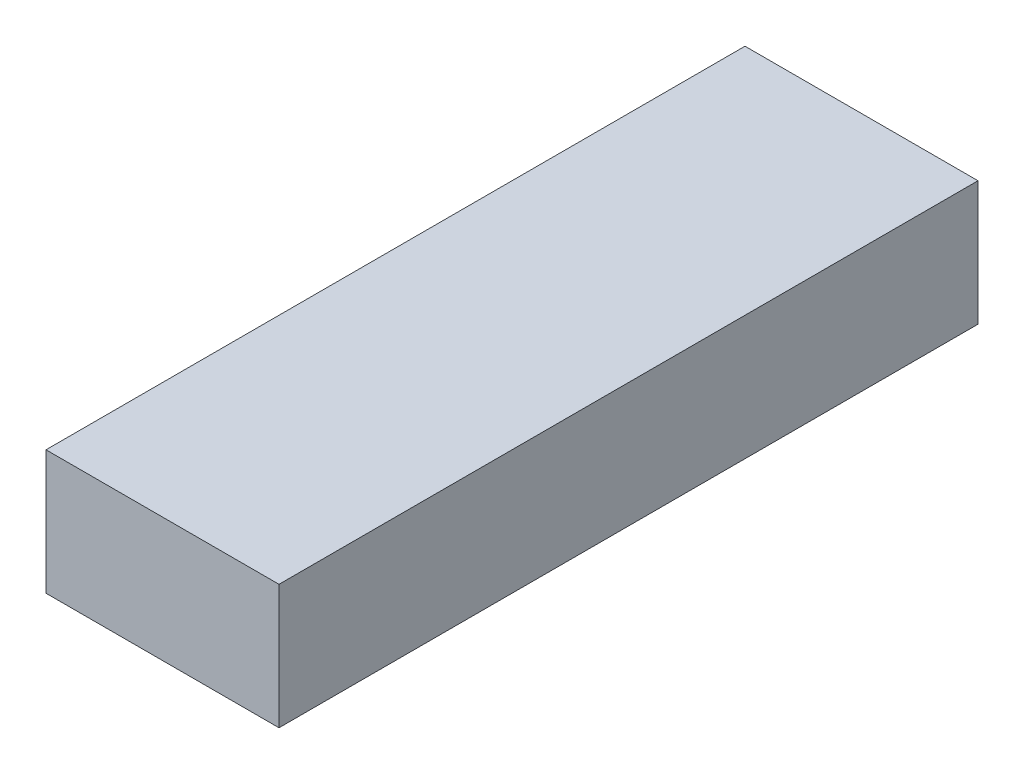
ISO-10303-21;
HEADER;
FILE_DESCRIPTION(('STEP AP214'),'2;1');
FILE_NAME('part.step','',(''),(''),'','','');
FILE_SCHEMA(('AUTOMOTIVE_DESIGN { 1 0 10303 214 1 1 1 1 }'));
ENDSEC;
DATA;
#1=APPLICATION_CONTEXT('core data for automotive mechanical design processes');
#2=APPLICATION_PROTOCOL_DEFINITION('international standard','automotive_design',2000,#1);
#3=PRODUCT_CONTEXT('',#1,'mechanical');
#4=PRODUCT('Part','Part','',(#3));
#5=PRODUCT_RELATED_PRODUCT_CATEGORY('part','',(#4));
#6=PRODUCT_DEFINITION_FORMATION('','',#4);
#7=PRODUCT_DEFINITION_CONTEXT('part definition',#1,'design');
#8=PRODUCT_DEFINITION('design','',#6,#7);
#9=PRODUCT_DEFINITION_SHAPE('','',#8);
#10=(LENGTH_UNIT() NAMED_UNIT(*) SI_UNIT(.MILLI.,.METRE.));
#11=(NAMED_UNIT(*) PLANE_ANGLE_UNIT() SI_UNIT($,.RADIAN.));
#12=(NAMED_UNIT(*) SI_UNIT($,.STERADIAN.) SOLID_ANGLE_UNIT());
#13=UNCERTAINTY_MEASURE_WITH_UNIT(LENGTH_MEASURE(1.E-05),#10,'distance_accuracy_value','');
#14=(GEOMETRIC_REPRESENTATION_CONTEXT(3) GLOBAL_UNCERTAINTY_ASSIGNED_CONTEXT((#13)) GLOBAL_UNIT_ASSIGNED_CONTEXT((#10,
#11,#12)) REPRESENTATION_CONTEXT('',''));
#15=CARTESIAN_POINT('',(0.,0.,0.));
#16=DIRECTION('',(0.,0.,1.));
#17=DIRECTION('',(1.,0.,0.));
#18=AXIS2_PLACEMENT_3D('',#15,#16,#17);
#19=CARTESIAN_POINT('',(0.,0.,180.));
#20=DIRECTION('',(1.,0.,0.));
#21=DIRECTION('',(0.,1.,0.));
#22=AXIS2_PLACEMENT_3D('',#19,#20,#21);
#23=PLANE('',#22);
#24=DIRECTION('',(0.,-1.,0.));
#25=VECTOR('',#24,1.);
#26=CARTESIAN_POINT('',(0.,0.,0.));
#27=LINE('',#26,#25);
#28=CARTESIAN_POINT('',(0.,32.,0.));
#29=VERTEX_POINT('',#28);
#30=CARTESIAN_POINT('',(0.,0.,0.));
#31=VERTEX_POINT('',#30);
#32=EDGE_CURVE('E270',#29,#31,#27,.T.);
#33=ORIENTED_EDGE('',*,*,#32,.T.);
#34=DIRECTION('',(0.,0.,-1.));
#35=VECTOR('',#34,1.);
#36=CARTESIAN_POINT('',(0.,0.,180.));
#37=LINE('',#36,#35);
#38=CARTESIAN_POINT('',(0.,0.,180.));
#39=VERTEX_POINT('',#38);
#40=EDGE_CURVE('E11',#39,#31,#37,.T.);
#41=ORIENTED_EDGE('',*,*,#40,.F.);
#42=DIRECTION('',(0.,-1.,0.));
#43=VECTOR('',#42,1.);
#44=CARTESIAN_POINT('',(0.,0.,180.));
#45=LINE('',#44,#43);
#46=CARTESIAN_POINT('',(0.,32.,180.));
#47=VERTEX_POINT('',#46);
#48=EDGE_CURVE('E493',#47,#39,#45,.T.);
#49=ORIENTED_EDGE('',*,*,#48,.F.);
#50=DIRECTION('',(0.,0.,-1.));
#51=VECTOR('',#50,1.);
#52=CARTESIAN_POINT('',(0.,32.,180.));
#53=LINE('',#52,#51);
#54=EDGE_CURVE('E507',#47,#29,#53,.T.);
#55=ORIENTED_EDGE('',*,*,#54,.T.);
#56=EDGE_LOOP('',(#33,#41,#49,#55));
#57=FACE_BOUND('',#56,.T.);
#58=ADVANCED_FACE('F39',(#57),#23,.F.);
#59=CARTESIAN_POINT('',(0.,0.,180.));
#60=DIRECTION('',(0.,1.,0.));
#61=DIRECTION('',(0.,0.,1.));
#62=AXIS2_PLACEMENT_3D('',#59,#60,#61);
#63=PLANE('',#62);
#64=DIRECTION('',(1.,0.,0.));
#65=VECTOR('',#64,1.);
#66=CARTESIAN_POINT('',(2.,0.,152.));
#67=LINE('',#66,#65);
#68=CARTESIAN_POINT('',(2.,0.,152.));
#69=VERTEX_POINT('',#68);
#70=CARTESIAN_POINT('',(58.,0.,152.));
#71=VERTEX_POINT('',#70);
#72=EDGE_CURVE('E260',#69,#71,#67,.T.);
#73=ORIENTED_EDGE('',*,*,#72,.F.);
#74=DIRECTION('',(0.,0.,-1.));
#75=VECTOR('',#74,1.);
#76=CARTESIAN_POINT('',(2.,0.,178.));
#77=LINE('',#76,#75);
#78=CARTESIAN_POINT('',(2.,0.,178.));
#79=VERTEX_POINT('',#78);
#80=EDGE_CURVE('E54',#79,#69,#77,.T.);
#81=ORIENTED_EDGE('',*,*,#80,.F.);
#82=DIRECTION('',(-1.,0.,0.));
#83=VECTOR('',#82,1.);
#84=CARTESIAN_POINT('',(2.,0.,178.));
#85=LINE('',#84,#83);
#86=CARTESIAN_POINT('',(58.,0.,178.));
#87=VERTEX_POINT('',#86);
#88=EDGE_CURVE('E247',#87,#79,#85,.T.);
#89=ORIENTED_EDGE('',*,*,#88,.F.);
#90=DIRECTION('',(0.,0.,1.));
#91=VECTOR('',#90,1.);
#92=CARTESIAN_POINT('',(58.,0.,178.));
#93=LINE('',#92,#91);
#94=EDGE_CURVE('E251',#71,#87,#93,.T.);
#95=ORIENTED_EDGE('',*,*,#94,.F.);
#96=EDGE_LOOP('',(#73,#81,#89,#95));
#97=FACE_BOUND('',#96,.T.);
#98=DIRECTION('',(1.,0.,0.));
#99=VECTOR('',#98,1.);
#100=CARTESIAN_POINT('',(2.0000000000001,0.,122.5));
#101=LINE('',#100,#99);
#102=CARTESIAN_POINT('',(2.0000000000001,0.,122.5));
#103=VERTEX_POINT('',#102);
#104=CARTESIAN_POINT('',(58.0000000000001,0.,122.5));
#105=VERTEX_POINT('',#104);
#106=EDGE_CURVE('E296',#103,#105,#101,.T.);
#107=ORIENTED_EDGE('',*,*,#106,.F.);
#108=DIRECTION('',(0.,0.,-1.));
#109=VECTOR('',#108,1.);
#110=CARTESIAN_POINT('',(2.0000000000001,0.,148.5));
#111=LINE('',#110,#109);
#112=CARTESIAN_POINT('',(2.0000000000001,0.,148.5));
#113=VERTEX_POINT('',#112);
#114=EDGE_CURVE('E62',#113,#103,#111,.T.);
#115=ORIENTED_EDGE('',*,*,#114,.F.);
#116=DIRECTION('',(-1.,0.,0.));
#117=VECTOR('',#116,1.);
#118=CARTESIAN_POINT('',(2.0000000000001,0.,148.5));
#119=LINE('',#118,#117);
#120=CARTESIAN_POINT('',(58.0000000000001,0.,148.5));
#121=VERTEX_POINT('',#120);
#122=EDGE_CURVE('E281',#121,#113,#119,.T.);
#123=ORIENTED_EDGE('',*,*,#122,.F.);
#124=DIRECTION('',(0.,0.,1.));
#125=VECTOR('',#124,1.);
#126=CARTESIAN_POINT('',(58.0000000000001,0.,148.5));
#127=LINE('',#126,#125);
#128=EDGE_CURVE('E301',#105,#121,#127,.T.);
#129=ORIENTED_EDGE('',*,*,#128,.F.);
#130=EDGE_LOOP('',(#107,#115,#123,#129));
#131=FACE_BOUND('',#130,.T.);
#132=DIRECTION('',(1.,0.,0.));
#133=VECTOR('',#132,1.);
#134=CARTESIAN_POINT('',(2.0000000000002,0.,93.));
#135=LINE('',#134,#133);
#136=CARTESIAN_POINT('',(2.0000000000002,0.,93.));
#137=VERTEX_POINT('',#136);
#138=CARTESIAN_POINT('',(58.0000000000002,0.,93.));
#139=VERTEX_POINT('',#138);
#140=EDGE_CURVE('E339',#137,#139,#135,.T.);
#141=ORIENTED_EDGE('',*,*,#140,.F.);
#142=DIRECTION('',(0.,0.,-1.));
#143=VECTOR('',#142,1.);
#144=CARTESIAN_POINT('',(2.0000000000002,0.,119.));
#145=LINE('',#144,#143);
#146=CARTESIAN_POINT('',(2.0000000000002,0.,119.));
#147=VERTEX_POINT('',#146);
#148=EDGE_CURVE('E336',#147,#137,#145,.T.);
#149=ORIENTED_EDGE('',*,*,#148,.F.);
#150=DIRECTION('',(-1.,0.,0.));
#151=VECTOR('',#150,1.);
#152=CARTESIAN_POINT('',(2.0000000000002,0.,119.));
#153=LINE('',#152,#151);
#154=CARTESIAN_POINT('',(58.0000000000002,0.,119.));
#155=VERTEX_POINT('',#154);
#156=EDGE_CURVE('E323',#155,#147,#153,.T.);
#157=ORIENTED_EDGE('',*,*,#156,.F.);
#158=DIRECTION('',(0.,0.,1.));
#159=VECTOR('',#158,1.);
#160=CARTESIAN_POINT('',(58.0000000000002,0.,119.));
#161=LINE('',#160,#159);
#162=EDGE_CURVE('E344',#139,#155,#161,.T.);
#163=ORIENTED_EDGE('',*,*,#162,.F.);
#164=EDGE_LOOP('',(#141,#149,#157,#163));
#165=FACE_BOUND('',#164,.T.);
#166=DIRECTION('',(1.,0.,0.));
#167=VECTOR('',#166,1.);
#168=CARTESIAN_POINT('',(2.0000000000003,0.,63.5));
#169=LINE('',#168,#167);
#170=CARTESIAN_POINT('',(2.0000000000003,0.,63.5));
#171=VERTEX_POINT('',#170);
#172=CARTESIAN_POINT('',(58.0000000000003,0.,63.5));
#173=VERTEX_POINT('',#172);
#174=EDGE_CURVE('E383',#171,#173,#169,.T.);
#175=ORIENTED_EDGE('',*,*,#174,.F.);
#176=DIRECTION('',(0.,0.,-1.));
#177=VECTOR('',#176,1.);
#178=CARTESIAN_POINT('',(2.0000000000003,0.,89.5));
#179=LINE('',#178,#177);
#180=CARTESIAN_POINT('',(2.0000000000003,0.,89.5));
#181=VERTEX_POINT('',#180);
#182=EDGE_CURVE('E380',#181,#171,#179,.T.);
#183=ORIENTED_EDGE('',*,*,#182,.F.);
#184=DIRECTION('',(-1.,0.,0.));
#185=VECTOR('',#184,1.);
#186=CARTESIAN_POINT('',(2.0000000000003,0.,89.5));
#187=LINE('',#186,#185);
#188=CARTESIAN_POINT('',(58.0000000000003,0.,89.5));
#189=VERTEX_POINT('',#188);
#190=EDGE_CURVE('E367',#189,#181,#187,.T.);
#191=ORIENTED_EDGE('',*,*,#190,.F.);
#192=DIRECTION('',(0.,0.,1.));
#193=VECTOR('',#192,1.);
#194=CARTESIAN_POINT('',(58.0000000000003,0.,89.5));
#195=LINE('',#194,#193);
#196=EDGE_CURVE('E388',#173,#189,#195,.T.);
#197=ORIENTED_EDGE('',*,*,#196,.F.);
#198=EDGE_LOOP('',(#175,#183,#191,#197));
#199=FACE_BOUND('',#198,.T.);
#200=DIRECTION('',(1.,0.,0.));
#201=VECTOR('',#200,1.);
#202=CARTESIAN_POINT('',(2.0000000000004,0.,34.));
#203=LINE('',#202,#201);
#204=CARTESIAN_POINT('',(2.0000000000004,0.,34.));
#205=VERTEX_POINT('',#204);
#206=CARTESIAN_POINT('',(58.0000000000004,0.,34.));
#207=VERTEX_POINT('',#206);
#208=EDGE_CURVE('E427',#205,#207,#203,.T.);
#209=ORIENTED_EDGE('',*,*,#208,.F.);
#210=DIRECTION('',(0.,0.,-1.));
#211=VECTOR('',#210,1.);
#212=CARTESIAN_POINT('',(2.00000000000041,0.,60.));
#213=LINE('',#212,#211);
#214=CARTESIAN_POINT('',(2.00000000000041,0.,60.));
#215=VERTEX_POINT('',#214);
#216=EDGE_CURVE('E424',#215,#205,#213,.T.);
#217=ORIENTED_EDGE('',*,*,#216,.F.);
#218=DIRECTION('',(-1.,0.,0.));
#219=VECTOR('',#218,1.);
#220=CARTESIAN_POINT('',(2.00000000000041,0.,60.));
#221=LINE('',#220,#219);
#222=CARTESIAN_POINT('',(58.0000000000004,0.,60.));
#223=VERTEX_POINT('',#222);
#224=EDGE_CURVE('E411',#223,#215,#221,.T.);
#225=ORIENTED_EDGE('',*,*,#224,.F.);
#226=DIRECTION('',(0.,0.,1.));
#227=VECTOR('',#226,1.);
#228=CARTESIAN_POINT('',(58.0000000000004,0.,60.));
#229=LINE('',#228,#227);
#230=EDGE_CURVE('E432',#207,#223,#229,.T.);
#231=ORIENTED_EDGE('',*,*,#230,.F.);
#232=EDGE_LOOP('',(#209,#217,#225,#231));
#233=FACE_BOUND('',#232,.T.);
#234=DIRECTION('',(1.,0.,0.));
#235=VECTOR('',#234,1.);
#236=CARTESIAN_POINT('',(2.00000000000051,0.,4.5));
#237=LINE('',#236,#235);
#238=CARTESIAN_POINT('',(2.00000000000051,0.,4.50000000000003));
#239=VERTEX_POINT('',#238);
#240=CARTESIAN_POINT('',(58.0000000000005,0.,4.5));
#241=VERTEX_POINT('',#240);
#242=EDGE_CURVE('E471',#239,#241,#237,.T.);
#243=ORIENTED_EDGE('',*,*,#242,.F.);
#244=DIRECTION('',(0.,0.,-1.));
#245=VECTOR('',#244,1.);
#246=CARTESIAN_POINT('',(2.00000000000051,0.,30.5));
#247=LINE('',#246,#245);
#248=CARTESIAN_POINT('',(2.00000000000051,0.,30.5));
#249=VERTEX_POINT('',#248);
#250=EDGE_CURVE('E468',#249,#239,#247,.T.);
#251=ORIENTED_EDGE('',*,*,#250,.F.);
#252=DIRECTION('',(-1.,0.,0.));
#253=VECTOR('',#252,1.);
#254=CARTESIAN_POINT('',(2.00000000000051,0.,30.5));
#255=LINE('',#254,#253);
#256=CARTESIAN_POINT('',(58.0000000000005,0.,30.5));
#257=VERTEX_POINT('',#256);
#258=EDGE_CURVE('E455',#257,#249,#255,.T.);
#259=ORIENTED_EDGE('',*,*,#258,.F.);
#260=DIRECTION('',(0.,0.,1.));
#261=VECTOR('',#260,1.);
#262=CARTESIAN_POINT('',(58.0000000000005,0.,30.5));
#263=LINE('',#262,#261);
#264=EDGE_CURVE('E475',#241,#257,#263,.T.);
#265=ORIENTED_EDGE('',*,*,#264,.F.);
#266=EDGE_LOOP('',(#243,#251,#259,#265));
#267=FACE_BOUND('',#266,.T.);
#268=DIRECTION('',(1.,0.,0.));
#269=VECTOR('',#268,1.);
#270=CARTESIAN_POINT('',(0.,0.,0.));
#271=LINE('',#270,#269);
#272=CARTESIAN_POINT('',(60.,0.,0.));
#273=VERTEX_POINT('',#272);
#274=EDGE_CURVE('E511',#31,#273,#271,.T.);
#275=ORIENTED_EDGE('',*,*,#274,.T.);
#276=DIRECTION('',(0.,0.,-1.));
#277=VECTOR('',#276,1.);
#278=CARTESIAN_POINT('',(60.,0.,180.));
#279=LINE('',#278,#277);
#280=CARTESIAN_POINT('',(60.,0.,180.));
#281=VERTEX_POINT('',#280);
#282=EDGE_CURVE('E47',#281,#273,#279,.T.);
#283=ORIENTED_EDGE('',*,*,#282,.F.);
#284=DIRECTION('',(1.,0.,0.));
#285=VECTOR('',#284,1.);
#286=CARTESIAN_POINT('',(0.,0.,180.));
#287=LINE('',#286,#285);
#288=EDGE_CURVE('E497',#39,#281,#287,.T.);
#289=ORIENTED_EDGE('',*,*,#288,.F.);
#290=ORIENTED_EDGE('',*,*,#40,.T.);
#291=EDGE_LOOP('',(#275,#283,#289,#290));
#292=FACE_BOUND('',#291,.T.);
#293=ADVANCED_FACE('F547',(#97,#131,#165,#199,#233,#267,#292),#63,.F.);
#294=CARTESIAN_POINT('',(60.,0.,180.));
#295=DIRECTION('',(-1.,0.,0.));
#296=DIRECTION('',(0.,-1.,0.));
#297=AXIS2_PLACEMENT_3D('',#294,#295,#296);
#298=PLANE('',#297);
#299=DIRECTION('',(0.,1.,0.));
#300=VECTOR('',#299,1.);
#301=CARTESIAN_POINT('',(60.,0.,0.));
#302=LINE('',#301,#300);
#303=CARTESIAN_POINT('',(60.,32.,0.));
#304=VERTEX_POINT('',#303);
#305=EDGE_CURVE('E514',#273,#304,#302,.T.);
#306=ORIENTED_EDGE('',*,*,#305,.T.);
#307=DIRECTION('',(0.,0.,-1.));
#308=VECTOR('',#307,1.);
#309=CARTESIAN_POINT('',(60.,32.,180.));
#310=LINE('',#309,#308);
#311=CARTESIAN_POINT('',(60.,32.,180.));
#312=VERTEX_POINT('',#311);
#313=EDGE_CURVE('E522',#312,#304,#310,.T.);
#314=ORIENTED_EDGE('',*,*,#313,.F.);
#315=DIRECTION('',(0.,1.,0.));
#316=VECTOR('',#315,1.);
#317=CARTESIAN_POINT('',(60.,0.,180.));
#318=LINE('',#317,#316);
#319=EDGE_CURVE('E501',#281,#312,#318,.T.);
#320=ORIENTED_EDGE('',*,*,#319,.F.);
#321=ORIENTED_EDGE('',*,*,#282,.T.);
#322=EDGE_LOOP('',(#306,#314,#320,#321));
#323=FACE_BOUND('',#322,.T.);
#324=ADVANCED_FACE('F531',(#323),#298,.F.);
#325=CARTESIAN_POINT('',(0.,32.,180.));
#326=DIRECTION('',(0.,-1.,0.));
#327=DIRECTION('',(0.,0.,-1.));
#328=AXIS2_PLACEMENT_3D('',#325,#326,#327);
#329=PLANE('',#328);
#330=DIRECTION('',(-1.,0.,0.));
#331=VECTOR('',#330,1.);
#332=CARTESIAN_POINT('',(0.,32.,0.));
#333=LINE('',#332,#331);
#334=EDGE_CURVE('E498',#304,#29,#333,.T.);
#335=ORIENTED_EDGE('',*,*,#334,.T.);
#336=ORIENTED_EDGE('',*,*,#54,.F.);
#337=DIRECTION('',(-1.,0.,0.));
#338=VECTOR('',#337,1.);
#339=CARTESIAN_POINT('',(0.,32.,180.));
#340=LINE('',#339,#338);
#341=EDGE_CURVE('E504',#312,#47,#340,.T.);
#342=ORIENTED_EDGE('',*,*,#341,.F.);
#343=ORIENTED_EDGE('',*,*,#313,.T.);
#344=EDGE_LOOP('',(#335,#336,#342,#343));
#345=FACE_BOUND('',#344,.T.);
#346=ADVANCED_FACE('F540',(#345),#329,.F.);
#347=CARTESIAN_POINT('',(0.,0.,180.));
#348=DIRECTION('',(0.,0.,-1.));
#349=DIRECTION('',(-1.,0.,0.));
#350=AXIS2_PLACEMENT_3D('',#347,#348,#349);
#351=PLANE('',#350);
#352=ORIENTED_EDGE('',*,*,#48,.T.);
#353=ORIENTED_EDGE('',*,*,#288,.T.);
#354=ORIENTED_EDGE('',*,*,#319,.T.);
#355=ORIENTED_EDGE('',*,*,#341,.T.);
#356=EDGE_LOOP('',(#352,#353,#354,#355));
#357=FACE_BOUND('',#356,.T.);
#358=ADVANCED_FACE('F546',(#357),#351,.F.);
#359=CARTESIAN_POINT('',(0.,0.,0.));
#360=DIRECTION('',(0.,0.,-1.));
#361=DIRECTION('',(-1.,0.,0.));
#362=AXIS2_PLACEMENT_3D('',#359,#360,#361);
#363=PLANE('',#362);
#364=ORIENTED_EDGE('',*,*,#32,.F.);
#365=ORIENTED_EDGE('',*,*,#334,.F.);
#366=ORIENTED_EDGE('',*,*,#305,.F.);
#367=ORIENTED_EDGE('',*,*,#274,.F.);
#368=EDGE_LOOP('',(#364,#365,#366,#367));
#369=FACE_BOUND('',#368,.T.);
#370=ADVANCED_FACE('F537',(#369),#363,.T.);
#371=CARTESIAN_POINT('',(2.00000000000051,30.,30.5));
#372=DIRECTION('',(-1.,0.,0.));
#373=DIRECTION('',(0.,0.,1.));
#374=AXIS2_PLACEMENT_3D('',#371,#372,#373);
#375=PLANE('',#374);
#376=ORIENTED_EDGE('',*,*,#250,.T.);
#377=DIRECTION('',(0.,-1.,0.));
#378=VECTOR('',#377,1.);
#379=CARTESIAN_POINT('',(2.00000000000051,30.,4.5));
#380=LINE('',#379,#378);
#381=CARTESIAN_POINT('',(2.00000000000051,30.,4.5));
#382=VERTEX_POINT('',#381);
#383=EDGE_CURVE('E467',#382,#239,#380,.T.);
#384=ORIENTED_EDGE('',*,*,#383,.F.);
#385=DIRECTION('',(0.,0.,-1.));
#386=VECTOR('',#385,1.);
#387=CARTESIAN_POINT('',(2.00000000000051,30.,30.5));
#388=LINE('',#387,#386);
#389=CARTESIAN_POINT('',(2.00000000000051,30.,30.5));
#390=VERTEX_POINT('',#389);
#391=EDGE_CURVE('E450',#390,#382,#388,.T.);
#392=ORIENTED_EDGE('',*,*,#391,.F.);
#393=DIRECTION('',(0.,-1.,0.));
#394=VECTOR('',#393,1.);
#395=CARTESIAN_POINT('',(2.00000000000051,30.,30.5));
#396=LINE('',#395,#394);
#397=EDGE_CURVE('E428',#390,#249,#396,.T.);
#398=ORIENTED_EDGE('',*,*,#397,.T.);
#399=EDGE_LOOP('',(#376,#384,#392,#398));
#400=FACE_BOUND('',#399,.T.);
#401=ADVANCED_FACE('F561',(#400),#375,.F.);
#402=CARTESIAN_POINT('',(2.00000000000051,30.,30.5));
#403=DIRECTION('',(0.,0.,1.));
#404=DIRECTION('',(1.,0.,0.));
#405=AXIS2_PLACEMENT_3D('',#402,#403,#404);
#406=PLANE('',#405);
#407=ORIENTED_EDGE('',*,*,#258,.T.);
#408=ORIENTED_EDGE('',*,*,#397,.F.);
#409=DIRECTION('',(-1.,0.,0.));
#410=VECTOR('',#409,1.);
#411=CARTESIAN_POINT('',(2.00000000000051,30.,30.5));
#412=LINE('',#411,#410);
#413=CARTESIAN_POINT('',(58.0000000000005,30.,30.5));
#414=VERTEX_POINT('',#413);
#415=EDGE_CURVE('E463',#414,#390,#412,.T.);
#416=ORIENTED_EDGE('',*,*,#415,.F.);
#417=DIRECTION('',(0.,-1.,0.));
#418=VECTOR('',#417,1.);
#419=CARTESIAN_POINT('',(58.0000000000005,30.,30.5));
#420=LINE('',#419,#418);
#421=EDGE_CURVE('E484',#414,#257,#420,.T.);
#422=ORIENTED_EDGE('',*,*,#421,.T.);
#423=EDGE_LOOP('',(#407,#408,#416,#422));
#424=FACE_BOUND('',#423,.T.);
#425=ADVANCED_FACE('F566',(#424),#406,.F.);
#426=CARTESIAN_POINT('',(58.0000000000005,30.,30.5));
#427=DIRECTION('',(1.,0.,0.));
#428=DIRECTION('',(0.,0.,-1.));
#429=AXIS2_PLACEMENT_3D('',#426,#427,#428);
#430=PLANE('',#429);
#431=ORIENTED_EDGE('',*,*,#264,.T.);
#432=ORIENTED_EDGE('',*,*,#421,.F.);
#433=DIRECTION('',(0.,0.,1.));
#434=VECTOR('',#433,1.);
#435=CARTESIAN_POINT('',(58.0000000000005,30.,30.5));
#436=LINE('',#435,#434);
#437=CARTESIAN_POINT('',(58.0000000000005,30.,4.5));
#438=VERTEX_POINT('',#437);
#439=EDGE_CURVE('E459',#438,#414,#436,.T.);
#440=ORIENTED_EDGE('',*,*,#439,.F.);
#441=DIRECTION('',(0.,-1.,0.));
#442=VECTOR('',#441,1.);
#443=CARTESIAN_POINT('',(58.0000000000005,30.,4.5));
#444=LINE('',#443,#442);
#445=EDGE_CURVE('E487',#438,#241,#444,.T.);
#446=ORIENTED_EDGE('',*,*,#445,.T.);
#447=EDGE_LOOP('',(#431,#432,#440,#446));
#448=FACE_BOUND('',#447,.T.);
#449=ADVANCED_FACE('F572',(#448),#430,.F.);
#450=CARTESIAN_POINT('',(2.00000000000051,30.,4.5));
#451=DIRECTION('',(0.,0.,-1.));
#452=DIRECTION('',(-1.,0.,0.));
#453=AXIS2_PLACEMENT_3D('',#450,#451,#452);
#454=PLANE('',#453);
#455=ORIENTED_EDGE('',*,*,#242,.T.);
#456=ORIENTED_EDGE('',*,*,#445,.F.);
#457=DIRECTION('',(1.,0.,0.));
#458=VECTOR('',#457,1.);
#459=CARTESIAN_POINT('',(2.00000000000051,30.,4.5));
#460=LINE('',#459,#458);
#461=EDGE_CURVE('E454',#382,#438,#460,.T.);
#462=ORIENTED_EDGE('',*,*,#461,.F.);
#463=ORIENTED_EDGE('',*,*,#383,.T.);
#464=EDGE_LOOP('',(#455,#456,#462,#463));
#465=FACE_BOUND('',#464,.T.);
#466=ADVANCED_FACE('F568',(#465),#454,.F.);
#467=CARTESIAN_POINT('',(0.,30.,0.));
#468=DIRECTION('',(0.,-1.,0.));
#469=DIRECTION('',(0.,0.,-1.));
#470=AXIS2_PLACEMENT_3D('',#467,#468,#469);
#471=PLANE('',#470);
#472=ORIENTED_EDGE('',*,*,#391,.T.);
#473=ORIENTED_EDGE('',*,*,#461,.T.);
#474=ORIENTED_EDGE('',*,*,#439,.T.);
#475=ORIENTED_EDGE('',*,*,#415,.T.);
#476=EDGE_LOOP('',(#472,#473,#474,#475));
#477=FACE_BOUND('',#476,.T.);
#478=ADVANCED_FACE('F571',(#477),#471,.T.);
#479=CARTESIAN_POINT('',(2.00000000000041,30.,60.));
#480=DIRECTION('',(-1.,0.,0.));
#481=DIRECTION('',(0.,0.,1.));
#482=AXIS2_PLACEMENT_3D('',#479,#480,#481);
#483=PLANE('',#482);
#484=ORIENTED_EDGE('',*,*,#216,.T.);
#485=DIRECTION('',(0.,-1.,0.));
#486=VECTOR('',#485,1.);
#487=CARTESIAN_POINT('',(2.0000000000004,30.,34.));
#488=LINE('',#487,#486);
#489=CARTESIAN_POINT('',(2.0000000000004,30.,34.));
#490=VERTEX_POINT('',#489);
#491=EDGE_CURVE('E423',#490,#205,#488,.T.);
#492=ORIENTED_EDGE('',*,*,#491,.F.);
#493=DIRECTION('',(0.,0.,-1.));
#494=VECTOR('',#493,1.);
#495=CARTESIAN_POINT('',(2.00000000000041,30.,60.));
#496=LINE('',#495,#494);
#497=CARTESIAN_POINT('',(2.00000000000041,30.,60.));
#498=VERTEX_POINT('',#497);
#499=EDGE_CURVE('E406',#498,#490,#496,.T.);
#500=ORIENTED_EDGE('',*,*,#499,.F.);
#501=DIRECTION('',(0.,-1.,0.));
#502=VECTOR('',#501,1.);
#503=CARTESIAN_POINT('',(2.00000000000041,30.,60.));
#504=LINE('',#503,#502);
#505=EDGE_CURVE('E384',#498,#215,#504,.T.);
#506=ORIENTED_EDGE('',*,*,#505,.T.);
#507=EDGE_LOOP('',(#484,#492,#500,#506));
#508=FACE_BOUND('',#507,.T.);
#509=ADVANCED_FACE('F582',(#508),#483,.F.);
#510=CARTESIAN_POINT('',(2.00000000000041,30.,60.));
#511=DIRECTION('',(0.,0.,1.));
#512=DIRECTION('',(1.,0.,0.));
#513=AXIS2_PLACEMENT_3D('',#510,#511,#512);
#514=PLANE('',#513);
#515=ORIENTED_EDGE('',*,*,#224,.T.);
#516=ORIENTED_EDGE('',*,*,#505,.F.);
#517=DIRECTION('',(-1.,0.,0.));
#518=VECTOR('',#517,1.);
#519=CARTESIAN_POINT('',(2.00000000000041,30.,60.));
#520=LINE('',#519,#518);
#521=CARTESIAN_POINT('',(58.0000000000004,30.,60.));
#522=VERTEX_POINT('',#521);
#523=EDGE_CURVE('E419',#522,#498,#520,.T.);
#524=ORIENTED_EDGE('',*,*,#523,.F.);
#525=DIRECTION('',(0.,-1.,0.));
#526=VECTOR('',#525,1.);
#527=CARTESIAN_POINT('',(58.0000000000004,30.,60.));
#528=LINE('',#527,#526);
#529=EDGE_CURVE('E441',#522,#223,#528,.T.);
#530=ORIENTED_EDGE('',*,*,#529,.T.);
#531=EDGE_LOOP('',(#515,#516,#524,#530));
#532=FACE_BOUND('',#531,.T.);
#533=ADVANCED_FACE('F586',(#532),#514,.F.);
#534=CARTESIAN_POINT('',(58.0000000000004,30.,60.));
#535=DIRECTION('',(1.,0.,0.));
#536=DIRECTION('',(0.,0.,-1.));
#537=AXIS2_PLACEMENT_3D('',#534,#535,#536);
#538=PLANE('',#537);
#539=ORIENTED_EDGE('',*,*,#230,.T.);
#540=ORIENTED_EDGE('',*,*,#529,.F.);
#541=DIRECTION('',(0.,0.,1.));
#542=VECTOR('',#541,1.);
#543=CARTESIAN_POINT('',(58.0000000000004,30.,60.));
#544=LINE('',#543,#542);
#545=CARTESIAN_POINT('',(58.0000000000004,30.,34.));
#546=VERTEX_POINT('',#545);
#547=EDGE_CURVE('E415',#546,#522,#544,.T.);
#548=ORIENTED_EDGE('',*,*,#547,.F.);
#549=DIRECTION('',(0.,-1.,0.));
#550=VECTOR('',#549,1.);
#551=CARTESIAN_POINT('',(58.0000000000004,30.,34.));
#552=LINE('',#551,#550);
#553=EDGE_CURVE('E444',#546,#207,#552,.T.);
#554=ORIENTED_EDGE('',*,*,#553,.T.);
#555=EDGE_LOOP('',(#539,#540,#548,#554));
#556=FACE_BOUND('',#555,.T.);
#557=ADVANCED_FACE('F592',(#556),#538,.F.);
#558=CARTESIAN_POINT('',(2.0000000000004,30.,34.));
#559=DIRECTION('',(0.,0.,-1.));
#560=DIRECTION('',(-1.,0.,0.));
#561=AXIS2_PLACEMENT_3D('',#558,#559,#560);
#562=PLANE('',#561);
#563=ORIENTED_EDGE('',*,*,#208,.T.);
#564=ORIENTED_EDGE('',*,*,#553,.F.);
#565=DIRECTION('',(1.,0.,0.));
#566=VECTOR('',#565,1.);
#567=CARTESIAN_POINT('',(2.0000000000004,30.,34.));
#568=LINE('',#567,#566);
#569=EDGE_CURVE('E410',#490,#546,#568,.T.);
#570=ORIENTED_EDGE('',*,*,#569,.F.);
#571=ORIENTED_EDGE('',*,*,#491,.T.);
#572=EDGE_LOOP('',(#563,#564,#570,#571));
#573=FACE_BOUND('',#572,.T.);
#574=ADVANCED_FACE('F588',(#573),#562,.F.);
#575=CARTESIAN_POINT('',(0.,30.,0.));
#576=DIRECTION('',(0.,-1.,0.));
#577=DIRECTION('',(0.,0.,-1.));
#578=AXIS2_PLACEMENT_3D('',#575,#576,#577);
#579=PLANE('',#578);
#580=ORIENTED_EDGE('',*,*,#499,.T.);
#581=ORIENTED_EDGE('',*,*,#569,.T.);
#582=ORIENTED_EDGE('',*,*,#547,.T.);
#583=ORIENTED_EDGE('',*,*,#523,.T.);
#584=EDGE_LOOP('',(#580,#581,#582,#583));
#585=FACE_BOUND('',#584,.T.);
#586=ADVANCED_FACE('F591',(#585),#579,.T.);
#587=CARTESIAN_POINT('',(2.0000000000003,30.,89.5));
#588=DIRECTION('',(-1.,0.,0.));
#589=DIRECTION('',(0.,0.,1.));
#590=AXIS2_PLACEMENT_3D('',#587,#588,#589);
#591=PLANE('',#590);
#592=ORIENTED_EDGE('',*,*,#182,.T.);
#593=DIRECTION('',(0.,-1.,0.));
#594=VECTOR('',#593,1.);
#595=CARTESIAN_POINT('',(2.0000000000003,30.,63.5));
#596=LINE('',#595,#594);
#597=CARTESIAN_POINT('',(2.0000000000003,30.,63.5));
#598=VERTEX_POINT('',#597);
#599=EDGE_CURVE('E379',#598,#171,#596,.T.);
#600=ORIENTED_EDGE('',*,*,#599,.F.);
#601=DIRECTION('',(0.,0.,-1.));
#602=VECTOR('',#601,1.);
#603=CARTESIAN_POINT('',(2.0000000000003,30.,89.5));
#604=LINE('',#603,#602);
#605=CARTESIAN_POINT('',(2.0000000000003,30.,89.5));
#606=VERTEX_POINT('',#605);
#607=EDGE_CURVE('E362',#606,#598,#604,.T.);
#608=ORIENTED_EDGE('',*,*,#607,.F.);
#609=DIRECTION('',(0.,-1.,0.));
#610=VECTOR('',#609,1.);
#611=CARTESIAN_POINT('',(2.0000000000003,30.,89.5));
#612=LINE('',#611,#610);
#613=EDGE_CURVE('E340',#606,#181,#612,.T.);
#614=ORIENTED_EDGE('',*,*,#613,.T.);
#615=EDGE_LOOP('',(#592,#600,#608,#614));
#616=FACE_BOUND('',#615,.T.);
#617=ADVANCED_FACE('F602',(#616),#591,.F.);
#618=CARTESIAN_POINT('',(2.0000000000003,30.,89.5));
#619=DIRECTION('',(0.,0.,1.));
#620=DIRECTION('',(1.,0.,0.));
#621=AXIS2_PLACEMENT_3D('',#618,#619,#620);
#622=PLANE('',#621);
#623=ORIENTED_EDGE('',*,*,#190,.T.);
#624=ORIENTED_EDGE('',*,*,#613,.F.);
#625=DIRECTION('',(-1.,0.,0.));
#626=VECTOR('',#625,1.);
#627=CARTESIAN_POINT('',(2.0000000000003,30.,89.5));
#628=LINE('',#627,#626);
#629=CARTESIAN_POINT('',(58.0000000000003,30.,89.5));
#630=VERTEX_POINT('',#629);
#631=EDGE_CURVE('E375',#630,#606,#628,.T.);
#632=ORIENTED_EDGE('',*,*,#631,.F.);
#633=DIRECTION('',(0.,-1.,0.));
#634=VECTOR('',#633,1.);
#635=CARTESIAN_POINT('',(58.0000000000003,30.,89.5));
#636=LINE('',#635,#634);
#637=EDGE_CURVE('E397',#630,#189,#636,.T.);
#638=ORIENTED_EDGE('',*,*,#637,.T.);
#639=EDGE_LOOP('',(#623,#624,#632,#638));
#640=FACE_BOUND('',#639,.T.);
#641=ADVANCED_FACE('F606',(#640),#622,.F.);
#642=CARTESIAN_POINT('',(58.0000000000003,30.,89.5));
#643=DIRECTION('',(1.,0.,0.));
#644=DIRECTION('',(0.,0.,-1.));
#645=AXIS2_PLACEMENT_3D('',#642,#643,#644);
#646=PLANE('',#645);
#647=ORIENTED_EDGE('',*,*,#196,.T.);
#648=ORIENTED_EDGE('',*,*,#637,.F.);
#649=DIRECTION('',(0.,0.,1.));
#650=VECTOR('',#649,1.);
#651=CARTESIAN_POINT('',(58.0000000000003,30.,89.5));
#652=LINE('',#651,#650);
#653=CARTESIAN_POINT('',(58.0000000000003,30.,63.5));
#654=VERTEX_POINT('',#653);
#655=EDGE_CURVE('E371',#654,#630,#652,.T.);
#656=ORIENTED_EDGE('',*,*,#655,.F.);
#657=DIRECTION('',(0.,-1.,0.));
#658=VECTOR('',#657,1.);
#659=CARTESIAN_POINT('',(58.0000000000003,30.,63.5));
#660=LINE('',#659,#658);
#661=EDGE_CURVE('E400',#654,#173,#660,.T.);
#662=ORIENTED_EDGE('',*,*,#661,.T.);
#663=EDGE_LOOP('',(#647,#648,#656,#662));
#664=FACE_BOUND('',#663,.T.);
#665=ADVANCED_FACE('F612',(#664),#646,.F.);
#666=CARTESIAN_POINT('',(2.0000000000003,30.,63.5));
#667=DIRECTION('',(0.,0.,-1.));
#668=DIRECTION('',(-1.,0.,0.));
#669=AXIS2_PLACEMENT_3D('',#666,#667,#668);
#670=PLANE('',#669);
#671=ORIENTED_EDGE('',*,*,#174,.T.);
#672=ORIENTED_EDGE('',*,*,#661,.F.);
#673=DIRECTION('',(1.,0.,0.));
#674=VECTOR('',#673,1.);
#675=CARTESIAN_POINT('',(2.0000000000003,30.,63.5));
#676=LINE('',#675,#674);
#677=EDGE_CURVE('E366',#598,#654,#676,.T.);
#678=ORIENTED_EDGE('',*,*,#677,.F.);
#679=ORIENTED_EDGE('',*,*,#599,.T.);
#680=EDGE_LOOP('',(#671,#672,#678,#679));
#681=FACE_BOUND('',#680,.T.);
#682=ADVANCED_FACE('F608',(#681),#670,.F.);
#683=CARTESIAN_POINT('',(0.,30.,0.));
#684=DIRECTION('',(0.,-1.,0.));
#685=DIRECTION('',(0.,0.,-1.));
#686=AXIS2_PLACEMENT_3D('',#683,#684,#685);
#687=PLANE('',#686);
#688=ORIENTED_EDGE('',*,*,#607,.T.);
#689=ORIENTED_EDGE('',*,*,#677,.T.);
#690=ORIENTED_EDGE('',*,*,#655,.T.);
#691=ORIENTED_EDGE('',*,*,#631,.T.);
#692=EDGE_LOOP('',(#688,#689,#690,#691));
#693=FACE_BOUND('',#692,.T.);
#694=ADVANCED_FACE('F611',(#693),#687,.T.);
#695=CARTESIAN_POINT('',(2.0000000000002,30.,119.));
#696=DIRECTION('',(-1.,0.,0.));
#697=DIRECTION('',(0.,0.,1.));
#698=AXIS2_PLACEMENT_3D('',#695,#696,#697);
#699=PLANE('',#698);
#700=ORIENTED_EDGE('',*,*,#148,.T.);
#701=DIRECTION('',(0.,-1.,0.));
#702=VECTOR('',#701,1.);
#703=CARTESIAN_POINT('',(2.0000000000002,30.,93.));
#704=LINE('',#703,#702);
#705=CARTESIAN_POINT('',(2.0000000000002,30.,93.));
#706=VERTEX_POINT('',#705);
#707=EDGE_CURVE('E335',#706,#137,#704,.T.);
#708=ORIENTED_EDGE('',*,*,#707,.F.);
#709=DIRECTION('',(0.,0.,-1.));
#710=VECTOR('',#709,1.);
#711=CARTESIAN_POINT('',(2.0000000000002,30.,119.));
#712=LINE('',#711,#710);
#713=CARTESIAN_POINT('',(2.0000000000002,30.,119.));
#714=VERTEX_POINT('',#713);
#715=EDGE_CURVE('E318',#714,#706,#712,.T.);
#716=ORIENTED_EDGE('',*,*,#715,.F.);
#717=DIRECTION('',(0.,-1.,0.));
#718=VECTOR('',#717,1.);
#719=CARTESIAN_POINT('',(2.0000000000002,30.,119.));
#720=LINE('',#719,#718);
#721=EDGE_CURVE('E297',#714,#147,#720,.T.);
#722=ORIENTED_EDGE('',*,*,#721,.T.);
#723=EDGE_LOOP('',(#700,#708,#716,#722));
#724=FACE_BOUND('',#723,.T.);
#725=ADVANCED_FACE('F622',(#724),#699,.F.);
#726=CARTESIAN_POINT('',(2.0000000000002,30.,119.));
#727=DIRECTION('',(0.,0.,1.));
#728=DIRECTION('',(1.,0.,0.));
#729=AXIS2_PLACEMENT_3D('',#726,#727,#728);
#730=PLANE('',#729);
#731=ORIENTED_EDGE('',*,*,#156,.T.);
#732=ORIENTED_EDGE('',*,*,#721,.F.);
#733=DIRECTION('',(-1.,0.,0.));
#734=VECTOR('',#733,1.);
#735=CARTESIAN_POINT('',(2.0000000000002,30.,119.));
#736=LINE('',#735,#734);
#737=CARTESIAN_POINT('',(58.0000000000002,30.,119.));
#738=VERTEX_POINT('',#737);
#739=EDGE_CURVE('E331',#738,#714,#736,.T.);
#740=ORIENTED_EDGE('',*,*,#739,.F.);
#741=DIRECTION('',(0.,-1.,0.));
#742=VECTOR('',#741,1.);
#743=CARTESIAN_POINT('',(58.0000000000002,30.,119.));
#744=LINE('',#743,#742);
#745=EDGE_CURVE('E353',#738,#155,#744,.T.);
#746=ORIENTED_EDGE('',*,*,#745,.T.);
#747=EDGE_LOOP('',(#731,#732,#740,#746));
#748=FACE_BOUND('',#747,.T.);
#749=ADVANCED_FACE('F626',(#748),#730,.F.);
#750=CARTESIAN_POINT('',(58.0000000000002,30.,119.));
#751=DIRECTION('',(1.,0.,0.));
#752=DIRECTION('',(0.,0.,-1.));
#753=AXIS2_PLACEMENT_3D('',#750,#751,#752);
#754=PLANE('',#753);
#755=ORIENTED_EDGE('',*,*,#162,.T.);
#756=ORIENTED_EDGE('',*,*,#745,.F.);
#757=DIRECTION('',(0.,0.,1.));
#758=VECTOR('',#757,1.);
#759=CARTESIAN_POINT('',(58.0000000000002,30.,119.));
#760=LINE('',#759,#758);
#761=CARTESIAN_POINT('',(58.0000000000002,30.,93.));
#762=VERTEX_POINT('',#761);
#763=EDGE_CURVE('E327',#762,#738,#760,.T.);
#764=ORIENTED_EDGE('',*,*,#763,.F.);
#765=DIRECTION('',(0.,-1.,0.));
#766=VECTOR('',#765,1.);
#767=CARTESIAN_POINT('',(58.0000000000002,30.,93.));
#768=LINE('',#767,#766);
#769=EDGE_CURVE('E356',#762,#139,#768,.T.);
#770=ORIENTED_EDGE('',*,*,#769,.T.);
#771=EDGE_LOOP('',(#755,#756,#764,#770));
#772=FACE_BOUND('',#771,.T.);
#773=ADVANCED_FACE('F632',(#772),#754,.F.);
#774=CARTESIAN_POINT('',(2.0000000000002,30.,93.));
#775=DIRECTION('',(0.,0.,-1.));
#776=DIRECTION('',(-1.,0.,0.));
#777=AXIS2_PLACEMENT_3D('',#774,#775,#776);
#778=PLANE('',#777);
#779=ORIENTED_EDGE('',*,*,#140,.T.);
#780=ORIENTED_EDGE('',*,*,#769,.F.);
#781=DIRECTION('',(1.,0.,0.));
#782=VECTOR('',#781,1.);
#783=CARTESIAN_POINT('',(2.0000000000002,30.,93.));
#784=LINE('',#783,#782);
#785=EDGE_CURVE('E322',#706,#762,#784,.T.);
#786=ORIENTED_EDGE('',*,*,#785,.F.);
#787=ORIENTED_EDGE('',*,*,#707,.T.);
#788=EDGE_LOOP('',(#779,#780,#786,#787));
#789=FACE_BOUND('',#788,.T.);
#790=ADVANCED_FACE('F628',(#789),#778,.F.);
#791=CARTESIAN_POINT('',(0.,30.,0.));
#792=DIRECTION('',(0.,-1.,0.));
#793=DIRECTION('',(0.,0.,-1.));
#794=AXIS2_PLACEMENT_3D('',#791,#792,#793);
#795=PLANE('',#794);
#796=ORIENTED_EDGE('',*,*,#715,.T.);
#797=ORIENTED_EDGE('',*,*,#785,.T.);
#798=ORIENTED_EDGE('',*,*,#763,.T.);
#799=ORIENTED_EDGE('',*,*,#739,.T.);
#800=EDGE_LOOP('',(#796,#797,#798,#799));
#801=FACE_BOUND('',#800,.T.);
#802=ADVANCED_FACE('F631',(#801),#795,.T.);
#803=CARTESIAN_POINT('',(2.0000000000001,30.,148.5));
#804=DIRECTION('',(-1.,0.,0.));
#805=DIRECTION('',(0.,0.,1.));
#806=AXIS2_PLACEMENT_3D('',#803,#804,#805);
#807=PLANE('',#806);
#808=ORIENTED_EDGE('',*,*,#114,.T.);
#809=DIRECTION('',(0.,-1.,0.));
#810=VECTOR('',#809,1.);
#811=CARTESIAN_POINT('',(2.0000000000001,30.,122.5));
#812=LINE('',#811,#810);
#813=CARTESIAN_POINT('',(2.0000000000001,30.,122.5));
#814=VERTEX_POINT('',#813);
#815=EDGE_CURVE('E293',#814,#103,#812,.T.);
#816=ORIENTED_EDGE('',*,*,#815,.F.);
#817=DIRECTION('',(0.,0.,-1.));
#818=VECTOR('',#817,1.);
#819=CARTESIAN_POINT('',(2.0000000000001,30.,148.5));
#820=LINE('',#819,#818);
#821=CARTESIAN_POINT('',(2.0000000000001,30.,148.5));
#822=VERTEX_POINT('',#821);
#823=EDGE_CURVE('E276',#822,#814,#820,.T.);
#824=ORIENTED_EDGE('',*,*,#823,.F.);
#825=DIRECTION('',(0.,-1.,0.));
#826=VECTOR('',#825,1.);
#827=CARTESIAN_POINT('',(2.0000000000001,30.,148.5));
#828=LINE('',#827,#826);
#829=EDGE_CURVE('E261',#822,#113,#828,.T.);
#830=ORIENTED_EDGE('',*,*,#829,.T.);
#831=EDGE_LOOP('',(#808,#816,#824,#830));
#832=FACE_BOUND('',#831,.T.);
#833=ADVANCED_FACE('F642',(#832),#807,.F.);
#834=CARTESIAN_POINT('',(2.0000000000001,30.,148.5));
#835=DIRECTION('',(0.,0.,1.));
#836=DIRECTION('',(1.,0.,0.));
#837=AXIS2_PLACEMENT_3D('',#834,#835,#836);
#838=PLANE('',#837);
#839=ORIENTED_EDGE('',*,*,#122,.T.);
#840=ORIENTED_EDGE('',*,*,#829,.F.);
#841=DIRECTION('',(-1.,0.,0.));
#842=VECTOR('',#841,1.);
#843=CARTESIAN_POINT('',(2.0000000000001,30.,148.5));
#844=LINE('',#843,#842);
#845=CARTESIAN_POINT('',(58.0000000000001,30.,148.5));
#846=VERTEX_POINT('',#845);
#847=EDGE_CURVE('E289',#846,#822,#844,.T.);
#848=ORIENTED_EDGE('',*,*,#847,.F.);
#849=DIRECTION('',(0.,-1.,0.));
#850=VECTOR('',#849,1.);
#851=CARTESIAN_POINT('',(58.0000000000001,30.,148.5));
#852=LINE('',#851,#850);
#853=EDGE_CURVE('E310',#846,#121,#852,.T.);
#854=ORIENTED_EDGE('',*,*,#853,.T.);
#855=EDGE_LOOP('',(#839,#840,#848,#854));
#856=FACE_BOUND('',#855,.T.);
#857=ADVANCED_FACE('F646',(#856),#838,.F.);
#858=CARTESIAN_POINT('',(58.0000000000001,30.,148.5));
#859=DIRECTION('',(1.,0.,0.));
#860=DIRECTION('',(0.,0.,-1.));
#861=AXIS2_PLACEMENT_3D('',#858,#859,#860);
#862=PLANE('',#861);
#863=ORIENTED_EDGE('',*,*,#128,.T.);
#864=ORIENTED_EDGE('',*,*,#853,.F.);
#865=DIRECTION('',(0.,0.,1.));
#866=VECTOR('',#865,1.);
#867=CARTESIAN_POINT('',(58.0000000000001,30.,148.5));
#868=LINE('',#867,#866);
#869=CARTESIAN_POINT('',(58.0000000000001,30.,122.5));
#870=VERTEX_POINT('',#869);
#871=EDGE_CURVE('E285',#870,#846,#868,.T.);
#872=ORIENTED_EDGE('',*,*,#871,.F.);
#873=DIRECTION('',(0.,-1.,0.));
#874=VECTOR('',#873,1.);
#875=CARTESIAN_POINT('',(58.0000000000001,30.,122.5));
#876=LINE('',#875,#874);
#877=EDGE_CURVE('E313',#870,#105,#876,.T.);
#878=ORIENTED_EDGE('',*,*,#877,.T.);
#879=EDGE_LOOP('',(#863,#864,#872,#878));
#880=FACE_BOUND('',#879,.T.);
#881=ADVANCED_FACE('F651',(#880),#862,.F.);
#882=CARTESIAN_POINT('',(2.0000000000001,30.,122.5));
#883=DIRECTION('',(0.,0.,-1.));
#884=DIRECTION('',(-1.,0.,0.));
#885=AXIS2_PLACEMENT_3D('',#882,#883,#884);
#886=PLANE('',#885);
#887=ORIENTED_EDGE('',*,*,#106,.T.);
#888=ORIENTED_EDGE('',*,*,#877,.F.);
#889=DIRECTION('',(1.,0.,0.));
#890=VECTOR('',#889,1.);
#891=CARTESIAN_POINT('',(2.0000000000001,30.,122.5));
#892=LINE('',#891,#890);
#893=EDGE_CURVE('E280',#814,#870,#892,.T.);
#894=ORIENTED_EDGE('',*,*,#893,.F.);
#895=ORIENTED_EDGE('',*,*,#815,.T.);
#896=EDGE_LOOP('',(#887,#888,#894,#895));
#897=FACE_BOUND('',#896,.T.);
#898=ADVANCED_FACE('F647',(#897),#886,.F.);
#899=CARTESIAN_POINT('',(0.,30.,0.));
#900=DIRECTION('',(0.,-1.,0.));
#901=DIRECTION('',(0.,0.,-1.));
#902=AXIS2_PLACEMENT_3D('',#899,#900,#901);
#903=PLANE('',#902);
#904=ORIENTED_EDGE('',*,*,#823,.T.);
#905=ORIENTED_EDGE('',*,*,#893,.T.);
#906=ORIENTED_EDGE('',*,*,#871,.T.);
#907=ORIENTED_EDGE('',*,*,#847,.T.);
#908=EDGE_LOOP('',(#904,#905,#906,#907));
#909=FACE_BOUND('',#908,.T.);
#910=ADVANCED_FACE('F650',(#909),#903,.T.);
#911=CARTESIAN_POINT('',(2.,30.,178.));
#912=DIRECTION('',(-1.,0.,0.));
#913=DIRECTION('',(0.,0.,1.));
#914=AXIS2_PLACEMENT_3D('',#911,#912,#913);
#915=PLANE('',#914);
#916=ORIENTED_EDGE('',*,*,#80,.T.);
#917=DIRECTION('',(0.,-1.,0.));
#918=VECTOR('',#917,1.);
#919=CARTESIAN_POINT('',(2.,30.,152.));
#920=LINE('',#919,#918);
#921=CARTESIAN_POINT('',(2.,30.,152.));
#922=VERTEX_POINT('',#921);
#923=EDGE_CURVE('E222',#922,#69,#920,.T.);
#924=ORIENTED_EDGE('',*,*,#923,.F.);
#925=DIRECTION('',(0.,0.,-1.));
#926=VECTOR('',#925,1.);
#927=CARTESIAN_POINT('',(2.,30.,178.));
#928=LINE('',#927,#926);
#929=CARTESIAN_POINT('',(2.,30.,178.));
#930=VERTEX_POINT('',#929);
#931=EDGE_CURVE('E226',#930,#922,#928,.T.);
#932=ORIENTED_EDGE('',*,*,#931,.F.);
#933=DIRECTION('',(0.,-1.,0.));
#934=VECTOR('',#933,1.);
#935=CARTESIAN_POINT('',(2.,30.,178.));
#936=LINE('',#935,#934);
#937=EDGE_CURVE('E267',#930,#79,#936,.T.);
#938=ORIENTED_EDGE('',*,*,#937,.T.);
#939=EDGE_LOOP('',(#916,#924,#932,#938));
#940=FACE_BOUND('',#939,.T.);
#941=ADVANCED_FACE('F224',(#940),#915,.F.);
#942=CARTESIAN_POINT('',(2.,30.,178.));
#943=DIRECTION('',(0.,0.,1.));
#944=DIRECTION('',(1.,0.,0.));
#945=AXIS2_PLACEMENT_3D('',#942,#943,#944);
#946=PLANE('',#945);
#947=ORIENTED_EDGE('',*,*,#88,.T.);
#948=ORIENTED_EDGE('',*,*,#937,.F.);
#949=DIRECTION('',(-1.,0.,0.));
#950=VECTOR('',#949,1.);
#951=CARTESIAN_POINT('',(2.,30.,178.));
#952=LINE('',#951,#950);
#953=CARTESIAN_POINT('',(58.,30.,178.));
#954=VERTEX_POINT('',#953);
#955=EDGE_CURVE('E233',#954,#930,#952,.T.);
#956=ORIENTED_EDGE('',*,*,#955,.F.);
#957=DIRECTION('',(0.,-1.,0.));
#958=VECTOR('',#957,1.);
#959=CARTESIAN_POINT('',(58.,30.,178.));
#960=LINE('',#959,#958);
#961=EDGE_CURVE('E271',#954,#87,#960,.T.);
#962=ORIENTED_EDGE('',*,*,#961,.T.);
#963=EDGE_LOOP('',(#947,#948,#956,#962));
#964=FACE_BOUND('',#963,.T.);
#965=ADVANCED_FACE('F664',(#964),#946,.F.);
#966=CARTESIAN_POINT('',(58.,30.,178.));
#967=DIRECTION('',(1.,0.,0.));
#968=DIRECTION('',(0.,0.,-1.));
#969=AXIS2_PLACEMENT_3D('',#966,#967,#968);
#970=PLANE('',#969);
#971=ORIENTED_EDGE('',*,*,#94,.T.);
#972=ORIENTED_EDGE('',*,*,#961,.F.);
#973=DIRECTION('',(0.,0.,1.));
#974=VECTOR('',#973,1.);
#975=CARTESIAN_POINT('',(58.,30.,178.));
#976=LINE('',#975,#974);
#977=CARTESIAN_POINT('',(58.,30.,152.));
#978=VERTEX_POINT('',#977);
#979=EDGE_CURVE('E242',#978,#954,#976,.T.);
#980=ORIENTED_EDGE('',*,*,#979,.F.);
#981=DIRECTION('',(0.,-1.,0.));
#982=VECTOR('',#981,1.);
#983=CARTESIAN_POINT('',(58.,30.,152.));
#984=LINE('',#983,#982);
#985=EDGE_CURVE('E232',#978,#71,#984,.T.);
#986=ORIENTED_EDGE('',*,*,#985,.T.);
#987=EDGE_LOOP('',(#971,#972,#980,#986));
#988=FACE_BOUND('',#987,.T.);
#989=ADVANCED_FACE('F667',(#988),#970,.F.);
#990=CARTESIAN_POINT('',(2.,30.,152.));
#991=DIRECTION('',(0.,0.,-1.));
#992=DIRECTION('',(-1.,0.,0.));
#993=AXIS2_PLACEMENT_3D('',#990,#991,#992);
#994=PLANE('',#993);
#995=ORIENTED_EDGE('',*,*,#72,.T.);
#996=ORIENTED_EDGE('',*,*,#985,.F.);
#997=DIRECTION('',(1.,0.,0.));
#998=VECTOR('',#997,1.);
#999=CARTESIAN_POINT('',(2.,30.,152.));
#1000=LINE('',#999,#998);
#1001=EDGE_CURVE('E236',#922,#978,#1000,.T.);
#1002=ORIENTED_EDGE('',*,*,#1001,.F.);
#1003=ORIENTED_EDGE('',*,*,#923,.T.);
#1004=EDGE_LOOP('',(#995,#996,#1002,#1003));
#1005=FACE_BOUND('',#1004,.T.);
#1006=ADVANCED_FACE('F237',(#1005),#994,.F.);
#1007=CARTESIAN_POINT('',(0.,30.,0.));
#1008=DIRECTION('',(0.,-1.,0.));
#1009=DIRECTION('',(0.,0.,-1.));
#1010=AXIS2_PLACEMENT_3D('',#1007,#1008,#1009);
#1011=PLANE('',#1010);
#1012=ORIENTED_EDGE('',*,*,#931,.T.);
#1013=ORIENTED_EDGE('',*,*,#1001,.T.);
#1014=ORIENTED_EDGE('',*,*,#979,.T.);
#1015=ORIENTED_EDGE('',*,*,#955,.T.);
#1016=EDGE_LOOP('',(#1012,#1013,#1014,#1015));
#1017=FACE_BOUND('',#1016,.T.);
#1018=ADVANCED_FACE('F244',(#1017),#1011,.T.);
#1019=CLOSED_SHELL('',(#58,#293,#324,#346,#358,#370,#401,#425,#449,#466,#478,#509,#533,#557,
#574,#586,#617,#641,#665,#682,#694,#725,#749,#773,#790,#802,#833,#857,#881,#898,#910,#941,#965,
#989,#1006,#1018));
#1020=MANIFOLD_SOLID_BREP('B2',#1019);
#1021=ADVANCED_BREP_SHAPE_REPRESENTATION('',(#18,#1020),#14);
#1022=SHAPE_DEFINITION_REPRESENTATION(#9,#1021);
ENDSEC;
END-ISO-10303-21;
